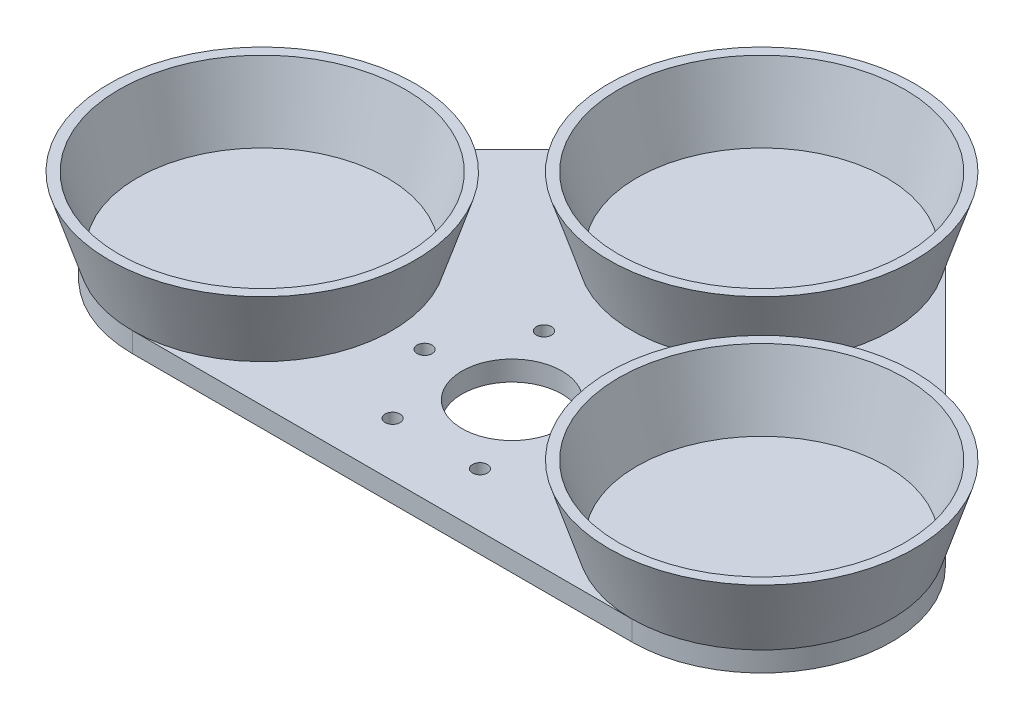
ISO-10303-21;
HEADER;
FILE_DESCRIPTION(('STEP AP214'),'2;1');
FILE_NAME('part.step','',(''),(''),'','','');
FILE_SCHEMA(('AUTOMOTIVE_DESIGN { 1 0 10303 214 1 1 1 1 }'));
ENDSEC;
DATA;
#1=APPLICATION_CONTEXT('core data for automotive mechanical design processes');
#2=APPLICATION_PROTOCOL_DEFINITION('international standard','automotive_design',2000,#1);
#3=PRODUCT_CONTEXT('',#1,'mechanical');
#4=PRODUCT('Part','Part','',(#3));
#5=PRODUCT_RELATED_PRODUCT_CATEGORY('part','',(#4));
#6=PRODUCT_DEFINITION_FORMATION('','',#4);
#7=PRODUCT_DEFINITION_CONTEXT('part definition',#1,'design');
#8=PRODUCT_DEFINITION('design','',#6,#7);
#9=PRODUCT_DEFINITION_SHAPE('','',#8);
#10=(LENGTH_UNIT() NAMED_UNIT(*) SI_UNIT(.MILLI.,.METRE.));
#11=(NAMED_UNIT(*) PLANE_ANGLE_UNIT() SI_UNIT($,.RADIAN.));
#12=(NAMED_UNIT(*) SI_UNIT($,.STERADIAN.) SOLID_ANGLE_UNIT());
#13=UNCERTAINTY_MEASURE_WITH_UNIT(LENGTH_MEASURE(1.E-05),#10,'distance_accuracy_value','');
#14=(GEOMETRIC_REPRESENTATION_CONTEXT(3) GLOBAL_UNCERTAINTY_ASSIGNED_CONTEXT((#13)) GLOBAL_UNIT_ASSIGNED_CONTEXT((#10,
#11,#12)) REPRESENTATION_CONTEXT('',''));
#15=CARTESIAN_POINT('',(0.,0.,0.));
#16=DIRECTION('',(0.,0.,1.));
#17=DIRECTION('',(1.,0.,0.));
#18=AXIS2_PLACEMENT_3D('',#15,#16,#17);
#19=CARTESIAN_POINT('',(-50.,-4.,0.));
#20=DIRECTION('',(0.,1.,0.));
#21=DIRECTION('',(0.,0.,1.));
#22=AXIS2_PLACEMENT_3D('',#19,#20,#21);
#23=CYLINDRICAL_SURFACE('',#22,26.);
#24=DIRECTION('',(0.,1.,0.));
#25=VECTOR('',#24,1.);
#26=CARTESIAN_POINT('',(-50.,-4.,26.));
#27=LINE('',#26,#25);
#28=CARTESIAN_POINT('',(-50.,-4.,26.));
#29=VERTEX_POINT('',#28);
#30=CARTESIAN_POINT('',(-50.,0.,26.));
#31=VERTEX_POINT('',#30);
#32=EDGE_CURVE('E103',#29,#31,#27,.T.);
#33=ORIENTED_EDGE('',*,*,#32,.T.);
#34=CARTESIAN_POINT('',(-50.,0.,0.));
#35=DIRECTION('',(0.,-1.,0.));
#36=DIRECTION('',(0.,0.,-1.));
#37=AXIS2_PLACEMENT_3D('',#34,#35,#36);
#38=CIRCLE('',#37,26.);
#39=CARTESIAN_POINT('',(-68.3847763108502,0.,-18.3847763108502));
#40=VERTEX_POINT('',#39);
#41=EDGE_CURVE('E290',#31,#40,#38,.T.);
#42=ORIENTED_EDGE('',*,*,#41,.T.);
#43=DIRECTION('',(0.,1.,0.));
#44=VECTOR('',#43,1.);
#45=CARTESIAN_POINT('',(-68.3847763108502,-4.,-18.3847763108502));
#46=LINE('',#45,#44);
#47=CARTESIAN_POINT('',(-68.3847763108502,-4.,-18.3847763108502));
#48=VERTEX_POINT('',#47);
#49=EDGE_CURVE('E114',#48,#40,#46,.T.);
#50=ORIENTED_EDGE('',*,*,#49,.F.);
#51=CARTESIAN_POINT('',(-50.,-4.,0.));
#52=DIRECTION('',(0.,-1.,0.));
#53=DIRECTION('',(0.,0.,-1.));
#54=AXIS2_PLACEMENT_3D('',#51,#52,#53);
#55=CIRCLE('',#54,26.);
#56=EDGE_CURVE('E117',#48,#29,#55,.F.);
#57=ORIENTED_EDGE('',*,*,#56,.T.);
#58=EDGE_LOOP('',(#33,#42,#50,#57));
#59=FACE_BOUND('',#58,.T.);
#60=ADVANCED_FACE('F43',(#59),#23,.T.);
#61=CARTESIAN_POINT('',(0.,1.,-50.));
#62=DIRECTION('',(0.,-1.,0.));
#63=DIRECTION('',(0.,0.,-1.));
#64=AXIS2_PLACEMENT_3D('',#61,#62,#63);
#65=CYLINDRICAL_SURFACE('',#64,26.);
#66=DIRECTION('',(0.,1.,0.));
#67=VECTOR('',#66,1.);
#68=CARTESIAN_POINT('',(-18.3847763108502,-4.,-68.3847763108502));
#69=LINE('',#68,#67);
#70=CARTESIAN_POINT('',(-18.3847763108502,-4.,-68.3847763108502));
#71=VERTEX_POINT('',#70);
#72=CARTESIAN_POINT('',(-18.3847763108502,0.,-68.3847763108502));
#73=VERTEX_POINT('',#72);
#74=EDGE_CURVE('E125',#71,#73,#69,.T.);
#75=ORIENTED_EDGE('',*,*,#74,.T.);
#76=CARTESIAN_POINT('',(0.,0.,-50.));
#77=DIRECTION('',(0.,-1.,0.));
#78=DIRECTION('',(0.,0.,-1.));
#79=AXIS2_PLACEMENT_3D('',#76,#77,#78);
#80=CIRCLE('',#79,26.);
#81=CARTESIAN_POINT('',(18.3847763108502,0.,-68.3847763108502));
#82=VERTEX_POINT('',#81);
#83=EDGE_CURVE('E292',#73,#82,#80,.T.);
#84=ORIENTED_EDGE('',*,*,#83,.T.);
#85=DIRECTION('',(0.,1.,0.));
#86=VECTOR('',#85,1.);
#87=CARTESIAN_POINT('',(18.3847763108502,-4.,-68.3847763108502));
#88=LINE('',#87,#86);
#89=CARTESIAN_POINT('',(18.3847763108502,-4.,-68.3847763108502));
#90=VERTEX_POINT('',#89);
#91=EDGE_CURVE('E91',#90,#82,#88,.T.);
#92=ORIENTED_EDGE('',*,*,#91,.F.);
#93=CARTESIAN_POINT('',(0.,-4.,-50.));
#94=DIRECTION('',(0.,-1.,0.));
#95=DIRECTION('',(0.,0.,-1.));
#96=AXIS2_PLACEMENT_3D('',#93,#94,#95);
#97=CIRCLE('',#96,26.);
#98=EDGE_CURVE('E338',#90,#71,#97,.F.);
#99=ORIENTED_EDGE('',*,*,#98,.T.);
#100=EDGE_LOOP('',(#75,#84,#92,#99));
#101=FACE_BOUND('',#100,.T.);
#102=ADVANCED_FACE('F45',(#101),#65,.T.);
#103=CARTESIAN_POINT('',(43.3847763108502,-4.,-43.3847763108502));
#104=DIRECTION('',(0.707106781186547,0.,-0.707106781186547));
#105=DIRECTION('',(-0.707106781186548,0.,-0.707106781186548));
#106=AXIS2_PLACEMENT_3D('',#103,#104,#105);
#107=PLANE('',#106);
#108=DIRECTION('',(-0.707106781186548,0.,-0.707106781186548));
#109=VECTOR('',#108,1.);
#110=CARTESIAN_POINT('',(43.3847763108502,0.,-43.3847763108502));
#111=LINE('',#110,#109);
#112=CARTESIAN_POINT('',(68.3847763108502,0.,-18.3847763108502));
#113=VERTEX_POINT('',#112);
#114=EDGE_CURVE('E132',#113,#82,#111,.T.);
#115=ORIENTED_EDGE('',*,*,#114,.F.);
#116=DIRECTION('',(0.,1.,0.));
#117=VECTOR('',#116,1.);
#118=CARTESIAN_POINT('',(68.3847763108502,-4.,-18.3847763108502));
#119=LINE('',#118,#117);
#120=CARTESIAN_POINT('',(68.3847763108502,-4.,-18.3847763108502));
#121=VERTEX_POINT('',#120);
#122=EDGE_CURVE('E142',#121,#113,#119,.T.);
#123=ORIENTED_EDGE('',*,*,#122,.F.);
#124=DIRECTION('',(-0.707106781186548,0.,-0.707106781186548));
#125=VECTOR('',#124,1.);
#126=CARTESIAN_POINT('',(43.3847763108502,-4.,-43.3847763108502));
#127=LINE('',#126,#125);
#128=EDGE_CURVE('E340',#121,#90,#127,.T.);
#129=ORIENTED_EDGE('',*,*,#128,.T.);
#130=ORIENTED_EDGE('',*,*,#91,.T.);
#131=EDGE_LOOP('',(#115,#123,#129,#130));
#132=FACE_BOUND('',#131,.T.);
#133=ADVANCED_FACE('F175',(#132),#107,.T.);
#134=CARTESIAN_POINT('',(50.,-4.,0.));
#135=DIRECTION('',(0.,1.,0.));
#136=DIRECTION('',(0.,0.,1.));
#137=AXIS2_PLACEMENT_3D('',#134,#135,#136);
#138=CYLINDRICAL_SURFACE('',#137,26.);
#139=ORIENTED_EDGE('',*,*,#122,.T.);
#140=CARTESIAN_POINT('',(50.,0.,0.));
#141=DIRECTION('',(0.,-1.,0.));
#142=DIRECTION('',(0.,0.,-1.));
#143=AXIS2_PLACEMENT_3D('',#140,#141,#142);
#144=CIRCLE('',#143,26.);
#145=CARTESIAN_POINT('',(50.,0.,26.));
#146=VERTEX_POINT('',#145);
#147=EDGE_CURVE('E275',#113,#146,#144,.T.);
#148=ORIENTED_EDGE('',*,*,#147,.T.);
#149=DIRECTION('',(0.,1.,0.));
#150=VECTOR('',#149,1.);
#151=CARTESIAN_POINT('',(50.,-4.,26.));
#152=LINE('',#151,#150);
#153=CARTESIAN_POINT('',(50.,-4.,26.));
#154=VERTEX_POINT('',#153);
#155=EDGE_CURVE('E113',#154,#146,#152,.T.);
#156=ORIENTED_EDGE('',*,*,#155,.F.);
#157=CARTESIAN_POINT('',(50.,-4.,0.));
#158=DIRECTION('',(0.,-1.,0.));
#159=DIRECTION('',(0.,0.,-1.));
#160=AXIS2_PLACEMENT_3D('',#157,#158,#159);
#161=CIRCLE('',#160,26.);
#162=EDGE_CURVE('E120',#121,#154,#161,.T.);
#163=ORIENTED_EDGE('',*,*,#162,.F.);
#164=EDGE_LOOP('',(#139,#148,#156,#163));
#165=FACE_BOUND('',#164,.T.);
#166=ADVANCED_FACE('F183',(#165),#138,.T.);
#167=CARTESIAN_POINT('',(0.,-4.,26.));
#168=DIRECTION('',(0.,0.,1.));
#169=DIRECTION('',(1.,0.,0.));
#170=AXIS2_PLACEMENT_3D('',#167,#168,#169);
#171=PLANE('',#170);
#172=DIRECTION('',(1.,0.,0.));
#173=VECTOR('',#172,1.);
#174=CARTESIAN_POINT('',(0.,0.,26.));
#175=LINE('',#174,#173);
#176=EDGE_CURVE('E108',#31,#146,#175,.T.);
#177=ORIENTED_EDGE('',*,*,#176,.F.);
#178=ORIENTED_EDGE('',*,*,#32,.F.);
#179=DIRECTION('',(1.,0.,0.));
#180=VECTOR('',#179,1.);
#181=CARTESIAN_POINT('',(0.,-4.,26.));
#182=LINE('',#181,#180);
#183=EDGE_CURVE('E107',#29,#154,#182,.T.);
#184=ORIENTED_EDGE('',*,*,#183,.T.);
#185=ORIENTED_EDGE('',*,*,#155,.T.);
#186=EDGE_LOOP('',(#177,#178,#184,#185));
#187=FACE_BOUND('',#186,.T.);
#188=ADVANCED_FACE('F105',(#187),#171,.T.);
#189=CARTESIAN_POINT('',(0.,-4.,0.));
#190=DIRECTION('',(0.,1.,0.));
#191=DIRECTION('',(0.,0.,1.));
#192=AXIS2_PLACEMENT_3D('',#189,#190,#191);
#193=CYLINDRICAL_SURFACE('',#192,10.);
#194=CARTESIAN_POINT('',(0.,-4.,0.));
#195=DIRECTION('',(0.,-1.,0.));
#196=DIRECTION('',(0.,0.,-1.));
#197=AXIS2_PLACEMENT_3D('',#194,#195,#196);
#198=CIRCLE('',#197,10.);
#199=CARTESIAN_POINT('',(0.,-4.,-10.));
#200=VERTEX_POINT('',#199);
#201=EDGE_CURVE('E138',#200,#200,#198,.T.);
#202=ORIENTED_EDGE('',*,*,#201,.T.);
#203=EDGE_LOOP('',(#202));
#204=FACE_BOUND('',#203,.T.);
#205=CARTESIAN_POINT('',(0.,0.,0.));
#206=DIRECTION('',(0.,-1.,0.));
#207=DIRECTION('',(0.,0.,-1.));
#208=AXIS2_PLACEMENT_3D('',#205,#206,#207);
#209=CIRCLE('',#208,10.);
#210=CARTESIAN_POINT('',(0.,0.,-10.));
#211=VERTEX_POINT('',#210);
#212=EDGE_CURVE('E129',#211,#211,#209,.T.);
#213=ORIENTED_EDGE('',*,*,#212,.F.);
#214=EDGE_LOOP('',(#213));
#215=FACE_BOUND('',#214,.T.);
#216=ADVANCED_FACE('F182',(#204,#215),#193,.F.);
#217=CARTESIAN_POINT('',(-43.3847763108502,-4.,-43.3847763108502));
#218=DIRECTION('',(0.707106781186547,0.,0.707106781186547));
#219=DIRECTION('',(0.707106781186548,0.,-0.707106781186548));
#220=AXIS2_PLACEMENT_3D('',#217,#218,#219);
#221=PLANE('',#220);
#222=DIRECTION('',(0.707106781186548,0.,-0.707106781186548));
#223=VECTOR('',#222,1.);
#224=CARTESIAN_POINT('',(-43.3847763108502,0.,-43.3847763108502));
#225=LINE('',#224,#223);
#226=EDGE_CURVE('E135',#40,#73,#225,.T.);
#227=ORIENTED_EDGE('',*,*,#226,.T.);
#228=ORIENTED_EDGE('',*,*,#74,.F.);
#229=DIRECTION('',(0.707106781186548,0.,-0.707106781186548));
#230=VECTOR('',#229,1.);
#231=CARTESIAN_POINT('',(-43.3847763108502,-4.,-43.3847763108502));
#232=LINE('',#231,#230);
#233=EDGE_CURVE('E60',#48,#71,#232,.T.);
#234=ORIENTED_EDGE('',*,*,#233,.F.);
#235=ORIENTED_EDGE('',*,*,#49,.T.);
#236=EDGE_LOOP('',(#227,#228,#234,#235));
#237=FACE_BOUND('',#236,.T.);
#238=ADVANCED_FACE('F178',(#237),#221,.F.);
#239=CARTESIAN_POINT('',(0.,-4.,0.));
#240=DIRECTION('',(0.,-1.,0.));
#241=DIRECTION('',(0.,0.,-1.));
#242=AXIS2_PLACEMENT_3D('',#239,#240,#241);
#243=PLANE('',#242);
#244=CARTESIAN_POINT('',(-8.74999999999996,-4.,15.1554445662277));
#245=DIRECTION('',(0.,1.,0.));
#246=DIRECTION('',(0.,0.,1.));
#247=AXIS2_PLACEMENT_3D('',#244,#245,#246);
#248=CIRCLE('',#247,1.5);
#249=CARTESIAN_POINT('',(-8.74999999999996,-4.,16.6554445662277));
#250=VERTEX_POINT('',#249);
#251=EDGE_CURVE('E304',#250,#250,#248,.T.);
#252=ORIENTED_EDGE('',*,*,#251,.T.);
#253=EDGE_LOOP('',(#252));
#254=FACE_BOUND('',#253,.T.);
#255=CARTESIAN_POINT('',(-8.74999999999996,-4.,-15.1554445662277));
#256=DIRECTION('',(0.,1.,0.));
#257=DIRECTION('',(0.,0.,-1.));
#258=AXIS2_PLACEMENT_3D('',#255,#256,#257);
#259=CIRCLE('',#258,1.5);
#260=CARTESIAN_POINT('',(-8.74999999999996,-4.,-16.6554445662277));
#261=VERTEX_POINT('',#260);
#262=EDGE_CURVE('E311',#261,#261,#259,.T.);
#263=ORIENTED_EDGE('',*,*,#262,.T.);
#264=EDGE_LOOP('',(#263));
#265=FACE_BOUND('',#264,.T.);
#266=CARTESIAN_POINT('',(-17.5,-4.,0.));
#267=DIRECTION('',(0.,1.,0.));
#268=DIRECTION('',(0.,0.,-1.));
#269=AXIS2_PLACEMENT_3D('',#266,#267,#268);
#270=CIRCLE('',#269,1.5);
#271=CARTESIAN_POINT('',(-17.5,-4.,-1.5));
#272=VERTEX_POINT('',#271);
#273=EDGE_CURVE('E310',#272,#272,#270,.T.);
#274=ORIENTED_EDGE('',*,*,#273,.T.);
#275=EDGE_LOOP('',(#274));
#276=FACE_BOUND('',#275,.T.);
#277=CARTESIAN_POINT('',(17.5,-4.,0.));
#278=DIRECTION('',(0.,1.,0.));
#279=DIRECTION('',(0.,0.,1.));
#280=AXIS2_PLACEMENT_3D('',#277,#278,#279);
#281=CIRCLE('',#280,1.5);
#282=CARTESIAN_POINT('',(17.5,-4.,1.5));
#283=VERTEX_POINT('',#282);
#284=EDGE_CURVE('E323',#283,#283,#281,.T.);
#285=ORIENTED_EDGE('',*,*,#284,.T.);
#286=EDGE_LOOP('',(#285));
#287=FACE_BOUND('',#286,.T.);
#288=CARTESIAN_POINT('',(8.74999999999996,-4.,15.1554445662277));
#289=DIRECTION('',(0.,1.,0.));
#290=DIRECTION('',(0.,0.,-1.));
#291=AXIS2_PLACEMENT_3D('',#288,#289,#290);
#292=CIRCLE('',#291,1.5);
#293=CARTESIAN_POINT('',(8.74999999999996,-4.,13.6554445662277));
#294=VERTEX_POINT('',#293);
#295=EDGE_CURVE('E300',#294,#294,#292,.T.);
#296=ORIENTED_EDGE('',*,*,#295,.T.);
#297=EDGE_LOOP('',(#296));
#298=FACE_BOUND('',#297,.T.);
#299=CARTESIAN_POINT('',(8.74999999999996,-4.,-15.1554445662277));
#300=DIRECTION('',(0.,1.,0.));
#301=DIRECTION('',(0.,0.,1.));
#302=AXIS2_PLACEMENT_3D('',#299,#300,#301);
#303=CIRCLE('',#302,1.5);
#304=CARTESIAN_POINT('',(8.74999999999996,-4.,-13.6554445662277));
#305=VERTEX_POINT('',#304);
#306=EDGE_CURVE('E331',#305,#305,#303,.T.);
#307=ORIENTED_EDGE('',*,*,#306,.T.);
#308=EDGE_LOOP('',(#307));
#309=FACE_BOUND('',#308,.T.);
#310=ORIENTED_EDGE('',*,*,#201,.F.);
#311=EDGE_LOOP('',(#310));
#312=FACE_BOUND('',#311,.T.);
#313=ORIENTED_EDGE('',*,*,#98,.F.);
#314=ORIENTED_EDGE('',*,*,#128,.F.);
#315=ORIENTED_EDGE('',*,*,#162,.T.);
#316=ORIENTED_EDGE('',*,*,#183,.F.);
#317=ORIENTED_EDGE('',*,*,#56,.F.);
#318=ORIENTED_EDGE('',*,*,#233,.T.);
#319=EDGE_LOOP('',(#313,#314,#315,#316,#317,#318));
#320=FACE_BOUND('',#319,.T.);
#321=ADVANCED_FACE('F116',(#254,#265,#276,#287,#298,#309,#312,#320),#243,.T.);
#322=CARTESIAN_POINT('',(0.,0.,0.));
#323=DIRECTION('',(0.,-1.,0.));
#324=DIRECTION('',(0.,0.,-1.));
#325=AXIS2_PLACEMENT_3D('',#322,#323,#324);
#326=PLANE('',#325);
#327=CARTESIAN_POINT('',(-8.74999999999996,0.,15.1554445662277));
#328=DIRECTION('',(0.,1.,0.));
#329=DIRECTION('',(0.,0.,1.));
#330=AXIS2_PLACEMENT_3D('',#327,#328,#329);
#331=CIRCLE('',#330,1.5);
#332=CARTESIAN_POINT('',(-8.74999999999996,0.,16.6554445662277));
#333=VERTEX_POINT('',#332);
#334=EDGE_CURVE('E314',#333,#333,#331,.T.);
#335=ORIENTED_EDGE('',*,*,#334,.F.);
#336=EDGE_LOOP('',(#335));
#337=FACE_BOUND('',#336,.T.);
#338=CARTESIAN_POINT('',(-8.74999999999996,0.,-15.1554445662277));
#339=DIRECTION('',(0.,1.,0.));
#340=DIRECTION('',(0.,0.,-1.));
#341=AXIS2_PLACEMENT_3D('',#338,#339,#340);
#342=CIRCLE('',#341,1.5);
#343=CARTESIAN_POINT('',(-8.74999999999996,0.,-16.6554445662277));
#344=VERTEX_POINT('',#343);
#345=EDGE_CURVE('E307',#344,#344,#342,.T.);
#346=ORIENTED_EDGE('',*,*,#345,.F.);
#347=EDGE_LOOP('',(#346));
#348=FACE_BOUND('',#347,.T.);
#349=CARTESIAN_POINT('',(-17.5,0.,0.));
#350=DIRECTION('',(0.,1.,0.));
#351=DIRECTION('',(0.,0.,-1.));
#352=AXIS2_PLACEMENT_3D('',#349,#350,#351);
#353=CIRCLE('',#352,1.5);
#354=CARTESIAN_POINT('',(-17.5,0.,-1.5));
#355=VERTEX_POINT('',#354);
#356=EDGE_CURVE('E326',#355,#355,#353,.T.);
#357=ORIENTED_EDGE('',*,*,#356,.F.);
#358=EDGE_LOOP('',(#357));
#359=FACE_BOUND('',#358,.T.);
#360=CARTESIAN_POINT('',(17.5,0.,0.));
#361=DIRECTION('',(0.,1.,0.));
#362=DIRECTION('',(0.,0.,1.));
#363=AXIS2_PLACEMENT_3D('',#360,#361,#362);
#364=CIRCLE('',#363,1.5);
#365=CARTESIAN_POINT('',(17.5,0.,1.5));
#366=VERTEX_POINT('',#365);
#367=EDGE_CURVE('E319',#366,#366,#364,.T.);
#368=ORIENTED_EDGE('',*,*,#367,.F.);
#369=EDGE_LOOP('',(#368));
#370=FACE_BOUND('',#369,.T.);
#371=CARTESIAN_POINT('',(8.74999999999996,0.,15.1554445662277));
#372=DIRECTION('',(0.,1.,0.));
#373=DIRECTION('',(0.,0.,-1.));
#374=AXIS2_PLACEMENT_3D('',#371,#372,#373);
#375=CIRCLE('',#374,1.5);
#376=CARTESIAN_POINT('',(8.74999999999996,0.,13.6554445662277));
#377=VERTEX_POINT('',#376);
#378=EDGE_CURVE('E301',#377,#377,#375,.T.);
#379=ORIENTED_EDGE('',*,*,#378,.F.);
#380=EDGE_LOOP('',(#379));
#381=FACE_BOUND('',#380,.T.);
#382=CARTESIAN_POINT('',(8.74999999999996,0.,-15.1554445662277));
#383=DIRECTION('',(0.,1.,0.));
#384=DIRECTION('',(0.,0.,1.));
#385=AXIS2_PLACEMENT_3D('',#382,#383,#384);
#386=CIRCLE('',#385,1.5);
#387=CARTESIAN_POINT('',(8.74999999999996,0.,-13.6554445662277));
#388=VERTEX_POINT('',#387);
#389=EDGE_CURVE('E322',#388,#388,#386,.T.);
#390=ORIENTED_EDGE('',*,*,#389,.F.);
#391=EDGE_LOOP('',(#390));
#392=FACE_BOUND('',#391,.T.);
#393=CARTESIAN_POINT('',(-50.,0.,0.));
#394=DIRECTION('',(0.,1.,0.));
#395=DIRECTION('',(0.,0.,1.));
#396=AXIS2_PLACEMENT_3D('',#393,#394,#395);
#397=CIRCLE('',#396,26.);
#398=EDGE_CURVE('E76',#31,#40,#397,.T.);
#399=ORIENTED_EDGE('',*,*,#398,.F.);
#400=ORIENTED_EDGE('',*,*,#176,.T.);
#401=CARTESIAN_POINT('',(50.,0.,0.));
#402=DIRECTION('',(0.,-1.,0.));
#403=DIRECTION('',(0.,0.,-1.));
#404=AXIS2_PLACEMENT_3D('',#401,#402,#403);
#405=CIRCLE('',#404,26.);
#406=EDGE_CURVE('E147',#113,#146,#405,.F.);
#407=ORIENTED_EDGE('',*,*,#406,.F.);
#408=ORIENTED_EDGE('',*,*,#114,.T.);
#409=CARTESIAN_POINT('',(0.,0.,-50.));
#410=DIRECTION('',(0.,1.,0.));
#411=DIRECTION('',(0.,0.,1.));
#412=AXIS2_PLACEMENT_3D('',#409,#410,#411);
#413=CIRCLE('',#412,26.);
#414=EDGE_CURVE('E82',#73,#82,#413,.T.);
#415=ORIENTED_EDGE('',*,*,#414,.F.);
#416=ORIENTED_EDGE('',*,*,#226,.F.);
#417=EDGE_LOOP('',(#399,#400,#407,#408,#415,#416));
#418=FACE_BOUND('',#417,.T.);
#419=ORIENTED_EDGE('',*,*,#212,.T.);
#420=EDGE_LOOP('',(#419));
#421=FACE_BOUND('',#420,.T.);
#422=ADVANCED_FACE('F200',(#337,#348,#359,#370,#381,#392,#418,#421),#326,.F.);
#423=CARTESIAN_POINT('',(8.74999999999996,-4.,-15.1554445662277));
#424=DIRECTION('',(0.,1.,0.));
#425=DIRECTION('',(0.,0.,1.));
#426=AXIS2_PLACEMENT_3D('',#423,#424,#425);
#427=CYLINDRICAL_SURFACE('',#426,1.5);
#428=ORIENTED_EDGE('',*,*,#306,.F.);
#429=EDGE_LOOP('',(#428));
#430=FACE_BOUND('',#429,.T.);
#431=ORIENTED_EDGE('',*,*,#389,.T.);
#432=EDGE_LOOP('',(#431));
#433=FACE_BOUND('',#432,.T.);
#434=ADVANCED_FACE('F202',(#430,#433),#427,.F.);
#435=CARTESIAN_POINT('',(8.74999999999996,-4.,15.1554445662277));
#436=DIRECTION('',(0.,1.,0.));
#437=DIRECTION('',(0.,0.,1.));
#438=AXIS2_PLACEMENT_3D('',#435,#436,#437);
#439=CYLINDRICAL_SURFACE('',#438,1.5);
#440=ORIENTED_EDGE('',*,*,#295,.F.);
#441=EDGE_LOOP('',(#440));
#442=FACE_BOUND('',#441,.T.);
#443=ORIENTED_EDGE('',*,*,#378,.T.);
#444=EDGE_LOOP('',(#443));
#445=FACE_BOUND('',#444,.T.);
#446=ADVANCED_FACE('F208',(#442,#445),#439,.F.);
#447=CARTESIAN_POINT('',(17.5,-4.,0.));
#448=DIRECTION('',(0.,1.,0.));
#449=DIRECTION('',(0.,0.,1.));
#450=AXIS2_PLACEMENT_3D('',#447,#448,#449);
#451=CYLINDRICAL_SURFACE('',#450,1.5);
#452=ORIENTED_EDGE('',*,*,#284,.F.);
#453=EDGE_LOOP('',(#452));
#454=FACE_BOUND('',#453,.T.);
#455=ORIENTED_EDGE('',*,*,#367,.T.);
#456=EDGE_LOOP('',(#455));
#457=FACE_BOUND('',#456,.T.);
#458=ADVANCED_FACE('F231',(#454,#457),#451,.F.);
#459=CARTESIAN_POINT('',(-17.5,-4.,0.));
#460=DIRECTION('',(0.,1.,0.));
#461=DIRECTION('',(0.,0.,1.));
#462=AXIS2_PLACEMENT_3D('',#459,#460,#461);
#463=CYLINDRICAL_SURFACE('',#462,1.5);
#464=ORIENTED_EDGE('',*,*,#273,.F.);
#465=EDGE_LOOP('',(#464));
#466=FACE_BOUND('',#465,.T.);
#467=ORIENTED_EDGE('',*,*,#356,.T.);
#468=EDGE_LOOP('',(#467));
#469=FACE_BOUND('',#468,.T.);
#470=ADVANCED_FACE('F227',(#466,#469),#463,.F.);
#471=CARTESIAN_POINT('',(-8.74999999999996,-4.,-15.1554445662277));
#472=DIRECTION('',(0.,1.,0.));
#473=DIRECTION('',(0.,0.,1.));
#474=AXIS2_PLACEMENT_3D('',#471,#472,#473);
#475=CYLINDRICAL_SURFACE('',#474,1.5);
#476=ORIENTED_EDGE('',*,*,#262,.F.);
#477=EDGE_LOOP('',(#476));
#478=FACE_BOUND('',#477,.T.);
#479=ORIENTED_EDGE('',*,*,#345,.T.);
#480=EDGE_LOOP('',(#479));
#481=FACE_BOUND('',#480,.T.);
#482=ADVANCED_FACE('F230',(#478,#481),#475,.F.);
#483=CARTESIAN_POINT('',(-8.74999999999996,-4.,15.1554445662277));
#484=DIRECTION('',(0.,1.,0.));
#485=DIRECTION('',(0.,0.,1.));
#486=AXIS2_PLACEMENT_3D('',#483,#484,#485);
#487=CYLINDRICAL_SURFACE('',#486,1.5);
#488=ORIENTED_EDGE('',*,*,#251,.F.);
#489=EDGE_LOOP('',(#488));
#490=FACE_BOUND('',#489,.T.);
#491=ORIENTED_EDGE('',*,*,#334,.T.);
#492=EDGE_LOOP('',(#491));
#493=FACE_BOUND('',#492,.T.);
#494=ADVANCED_FACE('F236',(#490,#493),#487,.F.);
#495=CARTESIAN_POINT('',(0.,14.522961568047,-50.));
#496=DIRECTION('',(0.,1.,0.));
#497=DIRECTION('',(0.,0.,1.));
#498=AXIS2_PLACEMENT_3D('',#495,#496,#497);
#499=CONICAL_SURFACE('',#498,28.6234666314352,0.261799387799143);
#500=CARTESIAN_POINT('',(0.,1.,-50.));
#501=DIRECTION('',(0.,1.,0.));
#502=DIRECTION('',(0.,0.,1.));
#503=AXIS2_PLACEMENT_3D('',#500,#501,#502);
#504=CIRCLE('',#503,25.);
#505=CARTESIAN_POINT('',(0.,1.,-25.));
#506=VERTEX_POINT('',#505);
#507=EDGE_CURVE('E52',#506,#506,#504,.F.);
#508=ORIENTED_EDGE('',*,*,#507,.T.);
#509=EDGE_LOOP('',(#508));
#510=FACE_BOUND('',#509,.T.);
#511=CARTESIAN_POINT('',(0.,14.522961568047,-50.));
#512=DIRECTION('',(0.,-1.,0.));
#513=DIRECTION('',(0.,0.,-1.));
#514=AXIS2_PLACEMENT_3D('',#511,#512,#513);
#515=CIRCLE('',#514,28.6234666314352);
#516=CARTESIAN_POINT('',(0.,14.522961568047,-78.6234666314352));
#517=VERTEX_POINT('',#516);
#518=EDGE_CURVE('E297',#517,#517,#515,.T.);
#519=ORIENTED_EDGE('',*,*,#518,.F.);
#520=EDGE_LOOP('',(#519));
#521=FACE_BOUND('',#520,.T.);
#522=ADVANCED_FACE('F152',(#510,#521),#499,.F.);
#523=CARTESIAN_POINT('',(0.,14.522961568047,-80.6234666314352));
#524=DIRECTION('',(0.,1.,0.));
#525=DIRECTION('',(0.,0.,1.));
#526=AXIS2_PLACEMENT_3D('',#523,#524,#525);
#527=PLANE('',#526);
#528=ORIENTED_EDGE('',*,*,#518,.T.);
#529=EDGE_LOOP('',(#528));
#530=FACE_BOUND('',#529,.T.);
#531=CARTESIAN_POINT('',(0.,14.522961568047,-50.));
#532=DIRECTION('',(0.,-1.,0.));
#533=DIRECTION('',(0.,0.,-1.));
#534=AXIS2_PLACEMENT_3D('',#531,#532,#533);
#535=CIRCLE('',#534,30.6234666314352);
#536=CARTESIAN_POINT('',(0.,14.522961568047,-80.6234666314352));
#537=VERTEX_POINT('',#536);
#538=EDGE_CURVE('E294',#537,#537,#535,.T.);
#539=ORIENTED_EDGE('',*,*,#538,.F.);
#540=EDGE_LOOP('',(#539));
#541=FACE_BOUND('',#540,.T.);
#542=ADVANCED_FACE('F166',(#530,#541),#527,.T.);
#543=CARTESIAN_POINT('',(0.,0.,-50.));
#544=DIRECTION('',(0.,1.,0.));
#545=DIRECTION('',(0.,0.,1.));
#546=AXIS2_PLACEMENT_3D('',#543,#544,#545);
#547=CONICAL_SURFACE('',#546,26.,0.308210609216518);
#548=ORIENTED_EDGE('',*,*,#538,.T.);
#549=EDGE_LOOP('',(#548));
#550=FACE_BOUND('',#549,.T.);
#551=ORIENTED_EDGE('',*,*,#414,.T.);
#552=ORIENTED_EDGE('',*,*,#83,.F.);
#553=EDGE_LOOP('',(#551,#552));
#554=FACE_BOUND('',#553,.T.);
#555=ADVANCED_FACE('F158',(#550,#554),#547,.T.);
#556=CARTESIAN_POINT('',(0.,1.,-50.));
#557=DIRECTION('',(0.,1.,0.));
#558=DIRECTION('',(0.,0.,1.));
#559=AXIS2_PLACEMENT_3D('',#556,#557,#558);
#560=PLANE('',#559);
#561=ORIENTED_EDGE('',*,*,#507,.F.);
#562=EDGE_LOOP('',(#561));
#563=FACE_BOUND('',#562,.T.);
#564=ADVANCED_FACE('F155',(#563),#560,.T.);
#565=CARTESIAN_POINT('',(-50.,14.522961568047,0.));
#566=DIRECTION('',(0.,1.,0.));
#567=DIRECTION('',(0.,0.,1.));
#568=AXIS2_PLACEMENT_3D('',#565,#566,#567);
#569=CONICAL_SURFACE('',#568,30.6234666314353,0.308210609216525);
#570=ORIENTED_EDGE('',*,*,#41,.F.);
#571=ORIENTED_EDGE('',*,*,#398,.T.);
#572=EDGE_LOOP('',(#570,#571));
#573=FACE_BOUND('',#572,.T.);
#574=CARTESIAN_POINT('',(-50.,14.522961568047,0.));
#575=DIRECTION('',(0.,-1.,0.));
#576=DIRECTION('',(0.,0.,-1.));
#577=AXIS2_PLACEMENT_3D('',#574,#575,#576);
#578=CIRCLE('',#577,30.6234666314353);
#579=CARTESIAN_POINT('',(-50.,14.522961568047,-30.6234666314353));
#580=VERTEX_POINT('',#579);
#581=EDGE_CURVE('E287',#580,#580,#578,.T.);
#582=ORIENTED_EDGE('',*,*,#581,.T.);
#583=EDGE_LOOP('',(#582));
#584=FACE_BOUND('',#583,.T.);
#585=ADVANCED_FACE('F157',(#573,#584),#569,.T.);
#586=CARTESIAN_POINT('',(-78.6234666314353,14.522961568047,0.));
#587=DIRECTION('',(0.,-1.,0.));
#588=DIRECTION('',(0.,0.,-1.));
#589=AXIS2_PLACEMENT_3D('',#586,#587,#588);
#590=PLANE('',#589);
#591=ORIENTED_EDGE('',*,*,#581,.F.);
#592=EDGE_LOOP('',(#591));
#593=FACE_BOUND('',#592,.T.);
#594=CARTESIAN_POINT('',(-50.,14.522961568047,0.));
#595=DIRECTION('',(0.,-1.,0.));
#596=DIRECTION('',(0.,0.,-1.));
#597=AXIS2_PLACEMENT_3D('',#594,#595,#596);
#598=CIRCLE('',#597,28.6234666314353);
#599=CARTESIAN_POINT('',(-50.,14.522961568047,-28.6234666314353));
#600=VERTEX_POINT('',#599);
#601=EDGE_CURVE('E284',#600,#600,#598,.T.);
#602=ORIENTED_EDGE('',*,*,#601,.T.);
#603=EDGE_LOOP('',(#602));
#604=FACE_BOUND('',#603,.T.);
#605=ADVANCED_FACE('F163',(#593,#604),#590,.F.);
#606=CARTESIAN_POINT('',(-50.,0.999999999999997,0.));
#607=DIRECTION('',(0.,1.,0.));
#608=DIRECTION('',(0.,0.,1.));
#609=AXIS2_PLACEMENT_3D('',#606,#607,#608);
#610=CONICAL_SURFACE('',#609,25.,0.26179938779915);
#611=ORIENTED_EDGE('',*,*,#601,.F.);
#612=EDGE_LOOP('',(#611));
#613=FACE_BOUND('',#612,.T.);
#614=CARTESIAN_POINT('',(-50.,0.999999999999997,0.));
#615=DIRECTION('',(0.,-1.,0.));
#616=DIRECTION('',(0.,0.,-1.));
#617=AXIS2_PLACEMENT_3D('',#614,#615,#616);
#618=CIRCLE('',#617,25.);
#619=CARTESIAN_POINT('',(-50.,0.999999999999997,-25.));
#620=VERTEX_POINT('',#619);
#621=EDGE_CURVE('E278',#620,#620,#618,.T.);
#622=ORIENTED_EDGE('',*,*,#621,.T.);
#623=EDGE_LOOP('',(#622));
#624=FACE_BOUND('',#623,.T.);
#625=ADVANCED_FACE('F224',(#613,#624),#610,.F.);
#626=CARTESIAN_POINT('',(-50.,1.,0.));
#627=DIRECTION('',(0.,1.,0.));
#628=DIRECTION('',(0.,0.,1.));
#629=AXIS2_PLACEMENT_3D('',#626,#627,#628);
#630=PLANE('',#629);
#631=ORIENTED_EDGE('',*,*,#621,.F.);
#632=EDGE_LOOP('',(#631));
#633=FACE_BOUND('',#632,.T.);
#634=ADVANCED_FACE('F221',(#633),#630,.T.);
#635=CARTESIAN_POINT('',(50.,14.522961568047,0.));
#636=DIRECTION('',(0.,1.,0.));
#637=DIRECTION('',(0.,0.,1.));
#638=AXIS2_PLACEMENT_3D('',#635,#636,#637);
#639=CONICAL_SURFACE('',#638,28.6234666314352,0.261799387799143);
#640=CARTESIAN_POINT('',(50.,0.999999999999999,0.));
#641=DIRECTION('',(0.,1.,0.));
#642=DIRECTION('',(0.,0.,1.));
#643=AXIS2_PLACEMENT_3D('',#640,#641,#642);
#644=CIRCLE('',#643,25.);
#645=CARTESIAN_POINT('',(50.,0.999999999999999,25.));
#646=VERTEX_POINT('',#645);
#647=EDGE_CURVE('E11',#646,#646,#644,.F.);
#648=ORIENTED_EDGE('',*,*,#647,.T.);
#649=EDGE_LOOP('',(#648));
#650=FACE_BOUND('',#649,.T.);
#651=CARTESIAN_POINT('',(50.,14.522961568047,0.));
#652=DIRECTION('',(0.,-1.,0.));
#653=DIRECTION('',(0.,0.,-1.));
#654=AXIS2_PLACEMENT_3D('',#651,#652,#653);
#655=CIRCLE('',#654,28.6234666314352);
#656=CARTESIAN_POINT('',(50.,14.522961568047,-28.6234666314352));
#657=VERTEX_POINT('',#656);
#658=EDGE_CURVE('E271',#657,#657,#655,.T.);
#659=ORIENTED_EDGE('',*,*,#658,.F.);
#660=EDGE_LOOP('',(#659));
#661=FACE_BOUND('',#660,.T.);
#662=ADVANCED_FACE('F223',(#650,#661),#639,.F.);
#663=CARTESIAN_POINT('',(50.,0.,0.));
#664=DIRECTION('',(0.,1.,0.));
#665=DIRECTION('',(0.,0.,1.));
#666=AXIS2_PLACEMENT_3D('',#663,#664,#665);
#667=CONICAL_SURFACE('',#666,26.,0.308210609216518);
#668=CARTESIAN_POINT('',(50.,14.522961568047,0.));
#669=DIRECTION('',(0.,-1.,0.));
#670=DIRECTION('',(0.,0.,-1.));
#671=AXIS2_PLACEMENT_3D('',#668,#669,#670);
#672=CIRCLE('',#671,30.6234666314352);
#673=CARTESIAN_POINT('',(50.,14.522961568047,-30.6234666314352));
#674=VERTEX_POINT('',#673);
#675=EDGE_CURVE('E274',#674,#674,#672,.T.);
#676=ORIENTED_EDGE('',*,*,#675,.T.);
#677=EDGE_LOOP('',(#676));
#678=FACE_BOUND('',#677,.T.);
#679=ORIENTED_EDGE('',*,*,#147,.F.);
#680=ORIENTED_EDGE('',*,*,#406,.T.);
#681=EDGE_LOOP('',(#679,#680));
#682=FACE_BOUND('',#681,.T.);
#683=ADVANCED_FACE('F259',(#678,#682),#667,.T.);
#684=CARTESIAN_POINT('',(80.6234666314352,14.522961568047,0.));
#685=DIRECTION('',(0.,1.,0.));
#686=DIRECTION('',(0.,0.,1.));
#687=AXIS2_PLACEMENT_3D('',#684,#685,#686);
#688=PLANE('',#687);
#689=ORIENTED_EDGE('',*,*,#658,.T.);
#690=EDGE_LOOP('',(#689));
#691=FACE_BOUND('',#690,.T.);
#692=ORIENTED_EDGE('',*,*,#675,.F.);
#693=EDGE_LOOP('',(#692));
#694=FACE_BOUND('',#693,.T.);
#695=ADVANCED_FACE('F219',(#691,#694),#688,.T.);
#696=CARTESIAN_POINT('',(50.,1.,0.));
#697=DIRECTION('',(0.,1.,0.));
#698=DIRECTION('',(0.,0.,1.));
#699=AXIS2_PLACEMENT_3D('',#696,#697,#698);
#700=PLANE('',#699);
#701=ORIENTED_EDGE('',*,*,#647,.F.);
#702=EDGE_LOOP('',(#701));
#703=FACE_BOUND('',#702,.T.);
#704=ADVANCED_FACE('F216',(#703),#700,.T.);
#705=CLOSED_SHELL('',(#60,#102,#133,#166,#188,#216,#238,#321,#422,#434,#446,#458,#470,#482,#494,
#522,#542,#555,#564,#585,#605,#625,#634,#662,#683,#695,#704));
#706=MANIFOLD_SOLID_BREP('B2',#705);
#707=ADVANCED_BREP_SHAPE_REPRESENTATION('',(#18,#706),#14);
#708=SHAPE_DEFINITION_REPRESENTATION(#9,#707);
ENDSEC;
END-ISO-10303-21;
